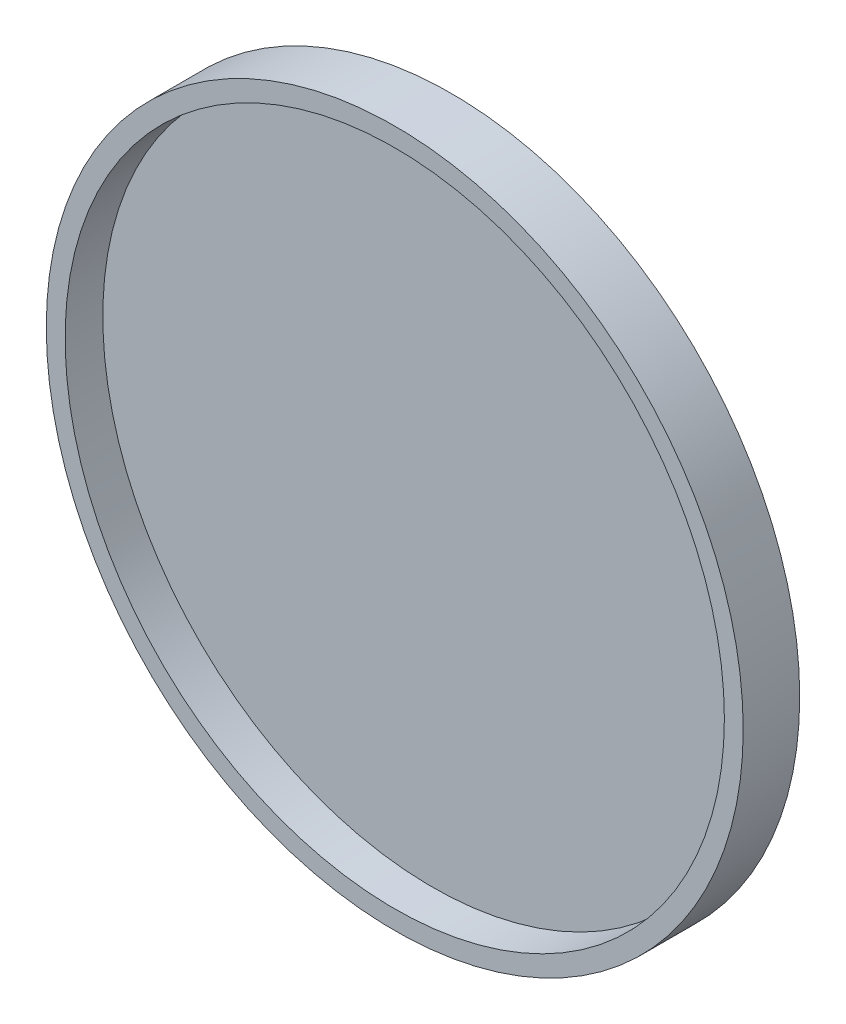
ISO-10303-21;
HEADER;
FILE_DESCRIPTION(('STEP AP214'),'2;1');
FILE_NAME('part.step','',(''),(''),'','','');
FILE_SCHEMA(('AUTOMOTIVE_DESIGN { 1 0 10303 214 1 1 1 1 }'));
ENDSEC;
DATA;
#1=APPLICATION_CONTEXT('core data for automotive mechanical design processes');
#2=APPLICATION_PROTOCOL_DEFINITION('international standard','automotive_design',2000,#1);
#3=PRODUCT_CONTEXT('',#1,'mechanical');
#4=PRODUCT('Part','Part','',(#3));
#5=PRODUCT_RELATED_PRODUCT_CATEGORY('part','',(#4));
#6=PRODUCT_DEFINITION_FORMATION('','',#4);
#7=PRODUCT_DEFINITION_CONTEXT('part definition',#1,'design');
#8=PRODUCT_DEFINITION('design','',#6,#7);
#9=PRODUCT_DEFINITION_SHAPE('','',#8);
#10=(LENGTH_UNIT() NAMED_UNIT(*) SI_UNIT(.MILLI.,.METRE.));
#11=(NAMED_UNIT(*) PLANE_ANGLE_UNIT() SI_UNIT($,.RADIAN.));
#12=(NAMED_UNIT(*) SI_UNIT($,.STERADIAN.) SOLID_ANGLE_UNIT());
#13=UNCERTAINTY_MEASURE_WITH_UNIT(LENGTH_MEASURE(1.E-05),#10,'distance_accuracy_value','');
#14=(GEOMETRIC_REPRESENTATION_CONTEXT(3) GLOBAL_UNCERTAINTY_ASSIGNED_CONTEXT((#13)) GLOBAL_UNIT_ASSIGNED_CONTEXT((#10,
#11,#12)) REPRESENTATION_CONTEXT('',''));
#15=CARTESIAN_POINT('',(0.,0.,0.));
#16=DIRECTION('',(0.,0.,1.));
#17=DIRECTION('',(1.,0.,0.));
#18=AXIS2_PLACEMENT_3D('',#15,#16,#17);
#19=CARTESIAN_POINT('',(0.,0.,6.));
#20=DIRECTION('',(0.,0.,-1.));
#21=DIRECTION('',(-1.,0.,0.));
#22=AXIS2_PLACEMENT_3D('',#19,#20,#21);
#23=CYLINDRICAL_SURFACE('',#22,37.);
#24=CARTESIAN_POINT('',(0.,0.,6.));
#25=DIRECTION('',(0.,0.,1.));
#26=DIRECTION('',(1.,0.,0.));
#27=AXIS2_PLACEMENT_3D('',#24,#25,#26);
#28=CIRCLE('',#27,37.);
#29=CARTESIAN_POINT('',(37.,0.,6.));
#30=VERTEX_POINT('',#29);
#31=EDGE_CURVE('E10',#30,#30,#28,.T.);
#32=ORIENTED_EDGE('',*,*,#31,.F.);
#33=EDGE_LOOP('',(#32));
#34=FACE_BOUND('',#33,.T.);
#35=CARTESIAN_POINT('',(0.,0.,0.));
#36=DIRECTION('',(0.,0.,1.));
#37=DIRECTION('',(1.,0.,0.));
#38=AXIS2_PLACEMENT_3D('',#35,#36,#37);
#39=CIRCLE('',#38,37.);
#40=CARTESIAN_POINT('',(37.,0.,0.));
#41=VERTEX_POINT('',#40);
#42=EDGE_CURVE('E34',#41,#41,#39,.T.);
#43=ORIENTED_EDGE('',*,*,#42,.T.);
#44=EDGE_LOOP('',(#43));
#45=FACE_BOUND('',#44,.T.);
#46=ADVANCED_FACE('F31',(#34,#45),#23,.T.);
#47=CARTESIAN_POINT('',(0.,0.,6.));
#48=DIRECTION('',(0.,0.,1.));
#49=DIRECTION('',(1.,0.,0.));
#50=AXIS2_PLACEMENT_3D('',#47,#48,#49);
#51=PLANE('',#50);
#52=CARTESIAN_POINT('',(0.,0.,6.));
#53=DIRECTION('',(0.,0.,1.));
#54=DIRECTION('',(1.,0.,0.));
#55=AXIS2_PLACEMENT_3D('',#52,#53,#54);
#56=CIRCLE('',#55,35.);
#57=CARTESIAN_POINT('',(35.,0.,6.));
#58=VERTEX_POINT('',#57);
#59=EDGE_CURVE('E43',#58,#58,#56,.T.);
#60=ORIENTED_EDGE('',*,*,#59,.F.);
#61=EDGE_LOOP('',(#60));
#62=FACE_BOUND('',#61,.T.);
#63=ORIENTED_EDGE('',*,*,#31,.T.);
#64=EDGE_LOOP('',(#63));
#65=FACE_BOUND('',#64,.T.);
#66=ADVANCED_FACE('F58',(#62,#65),#51,.T.);
#67=CARTESIAN_POINT('',(0.,0.,0.));
#68=DIRECTION('',(0.,0.,1.));
#69=DIRECTION('',(1.,0.,0.));
#70=AXIS2_PLACEMENT_3D('',#67,#68,#69);
#71=PLANE('',#70);
#72=ORIENTED_EDGE('',*,*,#42,.F.);
#73=EDGE_LOOP('',(#72));
#74=FACE_BOUND('',#73,.T.);
#75=ADVANCED_FACE('F54',(#74),#71,.F.);
#76=CARTESIAN_POINT('',(0.,0.,2.));
#77=DIRECTION('',(0.,0.,1.));
#78=DIRECTION('',(1.,0.,0.));
#79=AXIS2_PLACEMENT_3D('',#76,#77,#78);
#80=CYLINDRICAL_SURFACE('',#79,35.);
#81=CARTESIAN_POINT('',(0.,0.,2.));
#82=DIRECTION('',(0.,0.,1.));
#83=DIRECTION('',(1.,0.,0.));
#84=AXIS2_PLACEMENT_3D('',#81,#82,#83);
#85=CIRCLE('',#84,35.);
#86=CARTESIAN_POINT('',(35.,0.,2.));
#87=VERTEX_POINT('',#86);
#88=EDGE_CURVE('E41',#87,#87,#85,.T.);
#89=ORIENTED_EDGE('',*,*,#88,.F.);
#90=EDGE_LOOP('',(#89));
#91=FACE_BOUND('',#90,.T.);
#92=ORIENTED_EDGE('',*,*,#59,.T.);
#93=EDGE_LOOP('',(#92));
#94=FACE_BOUND('',#93,.T.);
#95=ADVANCED_FACE('F51',(#91,#94),#80,.F.);
#96=CARTESIAN_POINT('',(0.,0.,2.));
#97=DIRECTION('',(0.,0.,1.));
#98=DIRECTION('',(1.,0.,0.));
#99=AXIS2_PLACEMENT_3D('',#96,#97,#98);
#100=PLANE('',#99);
#101=ORIENTED_EDGE('',*,*,#88,.T.);
#102=EDGE_LOOP('',(#101));
#103=FACE_BOUND('',#102,.T.);
#104=ADVANCED_FACE('F49',(#103),#100,.T.);
#105=CLOSED_SHELL('',(#46,#66,#75,#95,#104));
#106=MANIFOLD_SOLID_BREP('B2',#105);
#107=ADVANCED_BREP_SHAPE_REPRESENTATION('',(#18,#106),#14);
#108=SHAPE_DEFINITION_REPRESENTATION(#9,#107);
ENDSEC;
END-ISO-10303-21;
